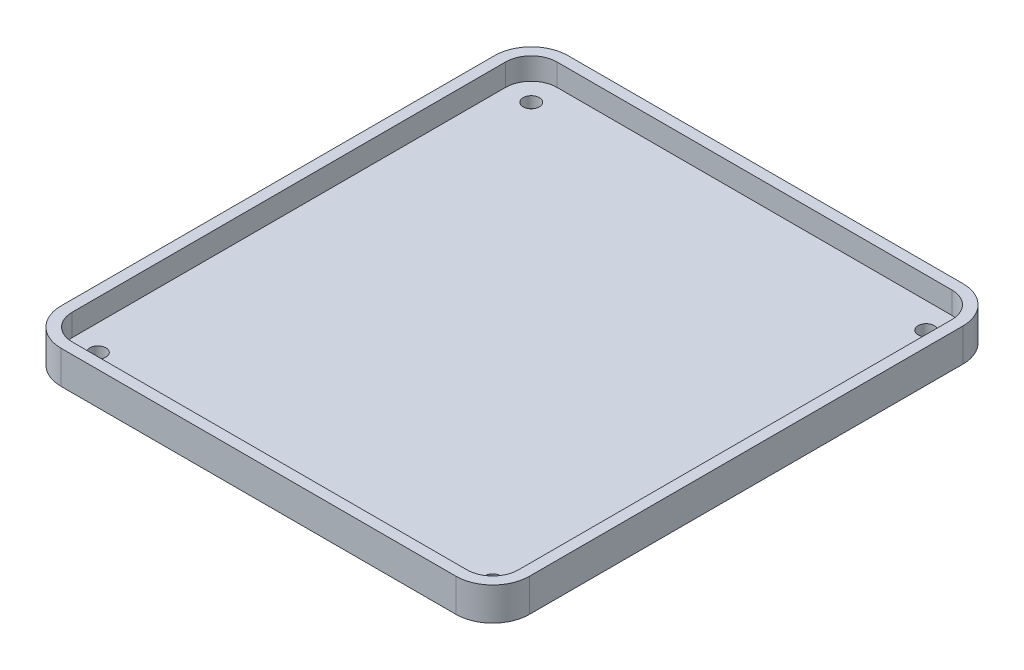
ISO-10303-21;
HEADER;
FILE_DESCRIPTION(('STEP AP214'),'2;1');
FILE_NAME('part.step','',(''),(''),'','','');
FILE_SCHEMA(('AUTOMOTIVE_DESIGN { 1 0 10303 214 1 1 1 1 }'));
ENDSEC;
DATA;
#1=APPLICATION_CONTEXT('core data for automotive mechanical design processes');
#2=APPLICATION_PROTOCOL_DEFINITION('international standard','automotive_design',2000,#1);
#3=PRODUCT_CONTEXT('',#1,'mechanical');
#4=PRODUCT('Part','Part','',(#3));
#5=PRODUCT_RELATED_PRODUCT_CATEGORY('part','',(#4));
#6=PRODUCT_DEFINITION_FORMATION('','',#4);
#7=PRODUCT_DEFINITION_CONTEXT('part definition',#1,'design');
#8=PRODUCT_DEFINITION('design','',#6,#7);
#9=PRODUCT_DEFINITION_SHAPE('','',#8);
#10=(LENGTH_UNIT() NAMED_UNIT(*) SI_UNIT(.MILLI.,.METRE.));
#11=(NAMED_UNIT(*) PLANE_ANGLE_UNIT() SI_UNIT($,.RADIAN.));
#12=(NAMED_UNIT(*) SI_UNIT($,.STERADIAN.) SOLID_ANGLE_UNIT());
#13=UNCERTAINTY_MEASURE_WITH_UNIT(LENGTH_MEASURE(1.E-05),#10,'distance_accuracy_value','');
#14=(GEOMETRIC_REPRESENTATION_CONTEXT(3) GLOBAL_UNCERTAINTY_ASSIGNED_CONTEXT((#13)) GLOBAL_UNIT_ASSIGNED_CONTEXT((#10,
#11,#12)) REPRESENTATION_CONTEXT('',''));
#15=CARTESIAN_POINT('',(0.,0.,0.));
#16=DIRECTION('',(0.,0.,1.));
#17=DIRECTION('',(1.,0.,0.));
#18=AXIS2_PLACEMENT_3D('',#15,#16,#17);
#19=CARTESIAN_POINT('',(10.,3.,-128.));
#20=DIRECTION('',(0.,-1.,0.));
#21=DIRECTION('',(0.,0.,-1.));
#22=AXIS2_PLACEMENT_3D('',#19,#20,#21);
#23=CYLINDRICAL_SURFACE('',#22,10.);
#24=CARTESIAN_POINT('',(10.,0.,-128.));
#25=DIRECTION('',(0.,1.,0.));
#26=DIRECTION('',(0.,0.,1.));
#27=AXIS2_PLACEMENT_3D('',#24,#25,#26);
#28=CIRCLE('',#27,10.);
#29=CARTESIAN_POINT('',(10.0000000000001,0.,-138.));
#30=VERTEX_POINT('',#29);
#31=CARTESIAN_POINT('',(0.,0.,-128.));
#32=VERTEX_POINT('',#31);
#33=EDGE_CURVE('E241',#30,#32,#28,.T.);
#34=ORIENTED_EDGE('',*,*,#33,.T.);
#35=DIRECTION('',(0.,-1.,0.));
#36=VECTOR('',#35,1.);
#37=CARTESIAN_POINT('',(0.,3.,-128.));
#38=LINE('',#37,#36);
#39=CARTESIAN_POINT('',(0.,9.,-128.));
#40=VERTEX_POINT('',#39);
#41=EDGE_CURVE('E11',#40,#32,#38,.T.);
#42=ORIENTED_EDGE('',*,*,#41,.F.);
#43=CARTESIAN_POINT('',(10.,9.,-128.));
#44=DIRECTION('',(0.,1.,0.));
#45=DIRECTION('',(0.,0.,1.));
#46=AXIS2_PLACEMENT_3D('',#43,#44,#45);
#47=CIRCLE('',#46,10.);
#48=CARTESIAN_POINT('',(10.0000000000001,9.,-138.));
#49=VERTEX_POINT('',#48);
#50=EDGE_CURVE('E165',#49,#40,#47,.T.);
#51=ORIENTED_EDGE('',*,*,#50,.F.);
#52=DIRECTION('',(0.,-1.,0.));
#53=VECTOR('',#52,1.);
#54=CARTESIAN_POINT('',(10.0000000000001,3.,-138.));
#55=LINE('',#54,#53);
#56=EDGE_CURVE('E258',#49,#30,#55,.T.);
#57=ORIENTED_EDGE('',*,*,#56,.T.);
#58=EDGE_LOOP('',(#34,#42,#51,#57));
#59=FACE_BOUND('',#58,.T.);
#60=ADVANCED_FACE('F39',(#59),#23,.T.);
#61=CARTESIAN_POINT('',(0.,3.,-10.0000000000001));
#62=DIRECTION('',(1.,0.,0.));
#63=DIRECTION('',(0.,0.,-1.));
#64=AXIS2_PLACEMENT_3D('',#61,#62,#63);
#65=PLANE('',#64);
#66=DIRECTION('',(0.,0.,1.));
#67=VECTOR('',#66,1.);
#68=CARTESIAN_POINT('',(0.,0.,-10.0000000000001));
#69=LINE('',#68,#67);
#70=CARTESIAN_POINT('',(0.,0.,-10.0000000000001));
#71=VERTEX_POINT('',#70);
#72=EDGE_CURVE('E244',#32,#71,#69,.T.);
#73=ORIENTED_EDGE('',*,*,#72,.T.);
#74=DIRECTION('',(0.,-1.,0.));
#75=VECTOR('',#74,1.);
#76=CARTESIAN_POINT('',(0.,3.,-10.0000000000001));
#77=LINE('',#76,#75);
#78=CARTESIAN_POINT('',(0.,9.,-10.0000000000001));
#79=VERTEX_POINT('',#78);
#80=EDGE_CURVE('E46',#79,#71,#77,.T.);
#81=ORIENTED_EDGE('',*,*,#80,.F.);
#82=DIRECTION('',(0.,0.,1.));
#83=VECTOR('',#82,1.);
#84=CARTESIAN_POINT('',(0.,9.,-128.));
#85=LINE('',#84,#83);
#86=EDGE_CURVE('E220',#40,#79,#85,.T.);
#87=ORIENTED_EDGE('',*,*,#86,.F.);
#88=ORIENTED_EDGE('',*,*,#41,.T.);
#89=EDGE_LOOP('',(#73,#81,#87,#88));
#90=FACE_BOUND('',#89,.T.);
#91=ADVANCED_FACE('F308',(#90),#65,.F.);
#92=CARTESIAN_POINT('',(10.,3.,-10.));
#93=DIRECTION('',(0.,-1.,0.));
#94=DIRECTION('',(0.,0.,-1.));
#95=AXIS2_PLACEMENT_3D('',#92,#93,#94);
#96=CYLINDRICAL_SURFACE('',#95,10.);
#97=CARTESIAN_POINT('',(10.,0.,-10.));
#98=DIRECTION('',(0.,1.,0.));
#99=DIRECTION('',(0.,0.,-1.));
#100=AXIS2_PLACEMENT_3D('',#97,#98,#99);
#101=CIRCLE('',#100,10.);
#102=CARTESIAN_POINT('',(10.0000000000001,0.,0.));
#103=VERTEX_POINT('',#102);
#104=EDGE_CURVE('E246',#71,#103,#101,.T.);
#105=ORIENTED_EDGE('',*,*,#104,.T.);
#106=DIRECTION('',(0.,-1.,0.));
#107=VECTOR('',#106,1.);
#108=CARTESIAN_POINT('',(10.0000000000001,3.,0.));
#109=LINE('',#108,#107);
#110=CARTESIAN_POINT('',(10.0000000000001,9.,0.));
#111=VERTEX_POINT('',#110);
#112=EDGE_CURVE('E273',#111,#103,#109,.T.);
#113=ORIENTED_EDGE('',*,*,#112,.F.);
#114=CARTESIAN_POINT('',(10.,9.,-10.));
#115=DIRECTION('',(0.,1.,0.));
#116=DIRECTION('',(0.,0.,1.));
#117=AXIS2_PLACEMENT_3D('',#114,#115,#116);
#118=CIRCLE('',#117,10.);
#119=EDGE_CURVE('E223',#79,#111,#118,.T.);
#120=ORIENTED_EDGE('',*,*,#119,.F.);
#121=ORIENTED_EDGE('',*,*,#80,.T.);
#122=EDGE_LOOP('',(#105,#113,#120,#121));
#123=FACE_BOUND('',#122,.T.);
#124=ADVANCED_FACE('F279',(#123),#96,.T.);
#125=CARTESIAN_POINT('',(10.0000000000001,3.,0.));
#126=DIRECTION('',(0.,0.,-1.));
#127=DIRECTION('',(-1.,0.,0.));
#128=AXIS2_PLACEMENT_3D('',#125,#126,#127);
#129=PLANE('',#128);
#130=DIRECTION('',(1.,0.,0.));
#131=VECTOR('',#130,1.);
#132=CARTESIAN_POINT('',(10.0000000000001,0.,0.));
#133=LINE('',#132,#131);
#134=CARTESIAN_POINT('',(117.5,0.,0.));
#135=VERTEX_POINT('',#134);
#136=EDGE_CURVE('E248',#103,#135,#133,.T.);
#137=ORIENTED_EDGE('',*,*,#136,.T.);
#138=DIRECTION('',(0.,-1.,0.));
#139=VECTOR('',#138,1.);
#140=CARTESIAN_POINT('',(117.5,3.,0.));
#141=LINE('',#140,#139);
#142=CARTESIAN_POINT('',(117.5,9.,0.));
#143=VERTEX_POINT('',#142);
#144=EDGE_CURVE('E270',#143,#135,#141,.T.);
#145=ORIENTED_EDGE('',*,*,#144,.F.);
#146=DIRECTION('',(1.,0.,0.));
#147=VECTOR('',#146,1.);
#148=CARTESIAN_POINT('',(10.0000000000001,9.,0.));
#149=LINE('',#148,#147);
#150=EDGE_CURVE('E226',#111,#143,#149,.T.);
#151=ORIENTED_EDGE('',*,*,#150,.F.);
#152=ORIENTED_EDGE('',*,*,#112,.T.);
#153=EDGE_LOOP('',(#137,#145,#151,#152));
#154=FACE_BOUND('',#153,.T.);
#155=ADVANCED_FACE('F289',(#154),#129,.F.);
#156=CARTESIAN_POINT('',(117.5,3.,-10.));
#157=DIRECTION('',(0.,-1.,0.));
#158=DIRECTION('',(0.,0.,-1.));
#159=AXIS2_PLACEMENT_3D('',#156,#157,#158);
#160=CYLINDRICAL_SURFACE('',#159,10.);
#161=CARTESIAN_POINT('',(117.5,0.,-10.));
#162=DIRECTION('',(0.,1.,0.));
#163=DIRECTION('',(0.,0.,1.));
#164=AXIS2_PLACEMENT_3D('',#161,#162,#163);
#165=CIRCLE('',#164,10.);
#166=CARTESIAN_POINT('',(127.5,0.,-10.0000000000001));
#167=VERTEX_POINT('',#166);
#168=EDGE_CURVE('E250',#135,#167,#165,.T.);
#169=ORIENTED_EDGE('',*,*,#168,.T.);
#170=DIRECTION('',(0.,-1.,0.));
#171=VECTOR('',#170,1.);
#172=CARTESIAN_POINT('',(127.5,3.,-10.0000000000001));
#173=LINE('',#172,#171);
#174=CARTESIAN_POINT('',(127.5,9.,-10.));
#175=VERTEX_POINT('',#174);
#176=EDGE_CURVE('E267',#175,#167,#173,.T.);
#177=ORIENTED_EDGE('',*,*,#176,.F.);
#178=CARTESIAN_POINT('',(117.5,9.,-10.));
#179=DIRECTION('',(0.,1.,0.));
#180=DIRECTION('',(0.,0.,1.));
#181=AXIS2_PLACEMENT_3D('',#178,#179,#180);
#182=CIRCLE('',#181,9.99999999999999);
#183=EDGE_CURVE('E229',#143,#175,#182,.T.);
#184=ORIENTED_EDGE('',*,*,#183,.F.);
#185=ORIENTED_EDGE('',*,*,#144,.T.);
#186=EDGE_LOOP('',(#169,#177,#184,#185));
#187=FACE_BOUND('',#186,.T.);
#188=ADVANCED_FACE('F293',(#187),#160,.T.);
#189=CARTESIAN_POINT('',(127.5,3.,-10.0000000000001));
#190=DIRECTION('',(-1.,0.,0.));
#191=DIRECTION('',(0.,0.,1.));
#192=AXIS2_PLACEMENT_3D('',#189,#190,#191);
#193=PLANE('',#192);
#194=DIRECTION('',(0.,0.,-1.));
#195=VECTOR('',#194,1.);
#196=CARTESIAN_POINT('',(127.5,0.,-10.0000000000001));
#197=LINE('',#196,#195);
#198=CARTESIAN_POINT('',(127.5,0.,-128.));
#199=VERTEX_POINT('',#198);
#200=EDGE_CURVE('E252',#167,#199,#197,.T.);
#201=ORIENTED_EDGE('',*,*,#200,.T.);
#202=DIRECTION('',(0.,-1.,0.));
#203=VECTOR('',#202,1.);
#204=CARTESIAN_POINT('',(127.5,3.,-128.));
#205=LINE('',#204,#203);
#206=CARTESIAN_POINT('',(127.5,9.,-128.));
#207=VERTEX_POINT('',#206);
#208=EDGE_CURVE('E264',#207,#199,#205,.T.);
#209=ORIENTED_EDGE('',*,*,#208,.F.);
#210=DIRECTION('',(0.,0.,-1.));
#211=VECTOR('',#210,1.);
#212=CARTESIAN_POINT('',(127.5,9.,-10.));
#213=LINE('',#212,#211);
#214=EDGE_CURVE('E232',#175,#207,#213,.T.);
#215=ORIENTED_EDGE('',*,*,#214,.F.);
#216=ORIENTED_EDGE('',*,*,#176,.T.);
#217=EDGE_LOOP('',(#201,#209,#215,#216));
#218=FACE_BOUND('',#217,.T.);
#219=ADVANCED_FACE('F298',(#218),#193,.F.);
#220=CARTESIAN_POINT('',(117.5,3.,-128.));
#221=DIRECTION('',(0.,-1.,0.));
#222=DIRECTION('',(0.,0.,-1.));
#223=AXIS2_PLACEMENT_3D('',#220,#221,#222);
#224=CYLINDRICAL_SURFACE('',#223,10.);
#225=CARTESIAN_POINT('',(117.5,0.,-128.));
#226=DIRECTION('',(0.,1.,0.));
#227=DIRECTION('',(0.,0.,1.));
#228=AXIS2_PLACEMENT_3D('',#225,#226,#227);
#229=CIRCLE('',#228,10.);
#230=CARTESIAN_POINT('',(117.5,0.,-138.));
#231=VERTEX_POINT('',#230);
#232=EDGE_CURVE('E254',#199,#231,#229,.T.);
#233=ORIENTED_EDGE('',*,*,#232,.T.);
#234=DIRECTION('',(0.,-1.,0.));
#235=VECTOR('',#234,1.);
#236=CARTESIAN_POINT('',(117.5,3.,-138.));
#237=LINE('',#236,#235);
#238=CARTESIAN_POINT('',(117.5,9.,-138.));
#239=VERTEX_POINT('',#238);
#240=EDGE_CURVE('E261',#239,#231,#237,.T.);
#241=ORIENTED_EDGE('',*,*,#240,.F.);
#242=CARTESIAN_POINT('',(117.5,9.,-128.));
#243=DIRECTION('',(0.,1.,0.));
#244=DIRECTION('',(0.,0.,1.));
#245=AXIS2_PLACEMENT_3D('',#242,#243,#244);
#246=CIRCLE('',#245,10.);
#247=EDGE_CURVE('E235',#207,#239,#246,.T.);
#248=ORIENTED_EDGE('',*,*,#247,.F.);
#249=ORIENTED_EDGE('',*,*,#208,.T.);
#250=EDGE_LOOP('',(#233,#241,#248,#249));
#251=FACE_BOUND('',#250,.T.);
#252=ADVANCED_FACE('F301',(#251),#224,.T.);
#253=CARTESIAN_POINT('',(10.0000000000001,3.,-138.));
#254=DIRECTION('',(0.,0.,1.));
#255=DIRECTION('',(1.,0.,0.));
#256=AXIS2_PLACEMENT_3D('',#253,#254,#255);
#257=PLANE('',#256);
#258=DIRECTION('',(-1.,0.,0.));
#259=VECTOR('',#258,1.);
#260=CARTESIAN_POINT('',(10.0000000000001,0.,-138.));
#261=LINE('',#260,#259);
#262=EDGE_CURVE('E256',#231,#30,#261,.T.);
#263=ORIENTED_EDGE('',*,*,#262,.T.);
#264=ORIENTED_EDGE('',*,*,#56,.F.);
#265=DIRECTION('',(-1.,0.,0.));
#266=VECTOR('',#265,1.);
#267=CARTESIAN_POINT('',(117.5,9.,-138.));
#268=LINE('',#267,#266);
#269=EDGE_CURVE('E238',#239,#49,#268,.T.);
#270=ORIENTED_EDGE('',*,*,#269,.F.);
#271=ORIENTED_EDGE('',*,*,#240,.T.);
#272=EDGE_LOOP('',(#263,#264,#270,#271));
#273=FACE_BOUND('',#272,.T.);
#274=ADVANCED_FACE('F304',(#273),#257,.F.);
#275=CARTESIAN_POINT('',(10.,0.,-128.));
#276=DIRECTION('',(0.,1.,0.));
#277=DIRECTION('',(0.,0.,1.));
#278=AXIS2_PLACEMENT_3D('',#275,#276,#277);
#279=PLANE('',#278);
#280=CARTESIAN_POINT('',(117.5,0.,-128.));
#281=DIRECTION('',(0.,1.,0.));
#282=DIRECTION('',(0.,0.,1.));
#283=AXIS2_PLACEMENT_3D('',#280,#281,#282);
#284=CIRCLE('',#283,2.2);
#285=CARTESIAN_POINT('',(117.5,0.,-125.8));
#286=VERTEX_POINT('',#285);
#287=EDGE_CURVE('E399',#286,#286,#284,.T.);
#288=ORIENTED_EDGE('',*,*,#287,.T.);
#289=EDGE_LOOP('',(#288));
#290=FACE_BOUND('',#289,.T.);
#291=CARTESIAN_POINT('',(10.,0.,-10.));
#292=DIRECTION('',(0.,1.,0.));
#293=DIRECTION('',(0.,0.,1.));
#294=AXIS2_PLACEMENT_3D('',#291,#292,#293);
#295=CIRCLE('',#294,2.2);
#296=CARTESIAN_POINT('',(10.,0.,-7.8));
#297=VERTEX_POINT('',#296);
#298=EDGE_CURVE('E388',#297,#297,#295,.T.);
#299=ORIENTED_EDGE('',*,*,#298,.T.);
#300=EDGE_LOOP('',(#299));
#301=FACE_BOUND('',#300,.T.);
#302=CARTESIAN_POINT('',(117.5,0.,-10.));
#303=DIRECTION('',(0.,1.,0.));
#304=DIRECTION('',(0.,0.,1.));
#305=AXIS2_PLACEMENT_3D('',#302,#303,#304);
#306=CIRCLE('',#305,2.2);
#307=CARTESIAN_POINT('',(117.5,0.,-7.80000000000001));
#308=VERTEX_POINT('',#307);
#309=EDGE_CURVE('E383',#308,#308,#306,.T.);
#310=ORIENTED_EDGE('',*,*,#309,.T.);
#311=EDGE_LOOP('',(#310));
#312=FACE_BOUND('',#311,.T.);
#313=CARTESIAN_POINT('',(9.99999999999999,0.,-128.));
#314=DIRECTION('',(0.,1.,0.));
#315=DIRECTION('',(0.,0.,1.));
#316=AXIS2_PLACEMENT_3D('',#313,#314,#315);
#317=CIRCLE('',#316,2.20000000000001);
#318=CARTESIAN_POINT('',(9.99999999999999,0.,-125.8));
#319=VERTEX_POINT('',#318);
#320=EDGE_CURVE('E188',#319,#319,#317,.T.);
#321=ORIENTED_EDGE('',*,*,#320,.T.);
#322=EDGE_LOOP('',(#321));
#323=FACE_BOUND('',#322,.T.);
#324=ORIENTED_EDGE('',*,*,#33,.F.);
#325=ORIENTED_EDGE('',*,*,#262,.F.);
#326=ORIENTED_EDGE('',*,*,#232,.F.);
#327=ORIENTED_EDGE('',*,*,#200,.F.);
#328=ORIENTED_EDGE('',*,*,#168,.F.);
#329=ORIENTED_EDGE('',*,*,#136,.F.);
#330=ORIENTED_EDGE('',*,*,#104,.F.);
#331=ORIENTED_EDGE('',*,*,#72,.F.);
#332=EDGE_LOOP('',(#324,#325,#326,#327,#328,#329,#330,#331));
#333=FACE_BOUND('',#332,.T.);
#334=ADVANCED_FACE('F285',(#290,#301,#312,#323,#333),#279,.F.);
#335=CARTESIAN_POINT('',(10.,9.,-128.));
#336=DIRECTION('',(0.,1.,0.));
#337=DIRECTION('',(0.,0.,1.));
#338=AXIS2_PLACEMENT_3D('',#335,#336,#337);
#339=PLANE('',#338);
#340=ORIENTED_EDGE('',*,*,#50,.T.);
#341=ORIENTED_EDGE('',*,*,#86,.T.);
#342=ORIENTED_EDGE('',*,*,#119,.T.);
#343=ORIENTED_EDGE('',*,*,#150,.T.);
#344=ORIENTED_EDGE('',*,*,#183,.T.);
#345=ORIENTED_EDGE('',*,*,#214,.T.);
#346=ORIENTED_EDGE('',*,*,#247,.T.);
#347=ORIENTED_EDGE('',*,*,#269,.T.);
#348=EDGE_LOOP('',(#340,#341,#342,#343,#344,#345,#346,#347));
#349=FACE_BOUND('',#348,.T.);
#350=DIRECTION('',(-1.,0.,0.));
#351=VECTOR('',#350,1.);
#352=CARTESIAN_POINT('',(117.5,9.,-135.));
#353=LINE('',#352,#351);
#354=CARTESIAN_POINT('',(117.5,9.,-135.));
#355=VERTEX_POINT('',#354);
#356=CARTESIAN_POINT('',(10.0000000000001,9.,-135.));
#357=VERTEX_POINT('',#356);
#358=EDGE_CURVE('E159',#355,#357,#353,.T.);
#359=ORIENTED_EDGE('',*,*,#358,.F.);
#360=CARTESIAN_POINT('',(117.5,9.,-128.));
#361=DIRECTION('',(0.,1.,0.));
#362=DIRECTION('',(0.,0.,1.));
#363=AXIS2_PLACEMENT_3D('',#360,#361,#362);
#364=CIRCLE('',#363,7.);
#365=CARTESIAN_POINT('',(124.5,9.,-128.));
#366=VERTEX_POINT('',#365);
#367=EDGE_CURVE('E150',#366,#355,#364,.T.);
#368=ORIENTED_EDGE('',*,*,#367,.F.);
#369=DIRECTION('',(0.,0.,-1.));
#370=VECTOR('',#369,1.);
#371=CARTESIAN_POINT('',(124.5,9.,-10.));
#372=LINE('',#371,#370);
#373=CARTESIAN_POINT('',(124.5,9.,-10.));
#374=VERTEX_POINT('',#373);
#375=EDGE_CURVE('E185',#374,#366,#372,.T.);
#376=ORIENTED_EDGE('',*,*,#375,.F.);
#377=CARTESIAN_POINT('',(117.5,9.,-10.));
#378=DIRECTION('',(0.,1.,0.));
#379=DIRECTION('',(0.,0.,1.));
#380=AXIS2_PLACEMENT_3D('',#377,#378,#379);
#381=CIRCLE('',#380,7.);
#382=CARTESIAN_POINT('',(117.5,9.,-3.));
#383=VERTEX_POINT('',#382);
#384=EDGE_CURVE('E182',#383,#374,#381,.T.);
#385=ORIENTED_EDGE('',*,*,#384,.F.);
#386=DIRECTION('',(1.,0.,0.));
#387=VECTOR('',#386,1.);
#388=CARTESIAN_POINT('',(10.,9.,-3.));
#389=LINE('',#388,#387);
#390=CARTESIAN_POINT('',(10.,9.,-3.));
#391=VERTEX_POINT('',#390);
#392=EDGE_CURVE('E180',#391,#383,#389,.T.);
#393=ORIENTED_EDGE('',*,*,#392,.F.);
#394=CARTESIAN_POINT('',(10.,9.,-10.));
#395=DIRECTION('',(0.,1.,0.));
#396=DIRECTION('',(0.,0.,1.));
#397=AXIS2_PLACEMENT_3D('',#394,#395,#396);
#398=CIRCLE('',#397,7.);
#399=CARTESIAN_POINT('',(3.,9.,-10.0000000000001));
#400=VERTEX_POINT('',#399);
#401=EDGE_CURVE('E178',#400,#391,#398,.T.);
#402=ORIENTED_EDGE('',*,*,#401,.F.);
#403=DIRECTION('',(0.,0.,1.));
#404=VECTOR('',#403,1.);
#405=CARTESIAN_POINT('',(2.99999999999999,9.,-128.));
#406=LINE('',#405,#404);
#407=CARTESIAN_POINT('',(2.99999999999999,9.,-128.));
#408=VERTEX_POINT('',#407);
#409=EDGE_CURVE('E173',#408,#400,#406,.T.);
#410=ORIENTED_EDGE('',*,*,#409,.F.);
#411=CARTESIAN_POINT('',(10.,9.,-128.));
#412=DIRECTION('',(0.,1.,0.));
#413=DIRECTION('',(0.,0.,1.));
#414=AXIS2_PLACEMENT_3D('',#411,#412,#413);
#415=CIRCLE('',#414,7.);
#416=EDGE_CURVE('E171',#357,#408,#415,.T.);
#417=ORIENTED_EDGE('',*,*,#416,.F.);
#418=EDGE_LOOP('',(#359,#368,#376,#385,#393,#402,#410,#417));
#419=FACE_BOUND('',#418,.T.);
#420=ADVANCED_FACE('F169',(#349,#419),#339,.T.);
#421=CARTESIAN_POINT('',(117.5,9.,-128.));
#422=DIRECTION('',(0.,-1.,0.));
#423=DIRECTION('',(0.,0.,-1.));
#424=AXIS2_PLACEMENT_3D('',#421,#422,#423);
#425=CYLINDRICAL_SURFACE('',#424,7.);
#426=CARTESIAN_POINT('',(117.5,3.,-128.));
#427=DIRECTION('',(0.,1.,0.));
#428=DIRECTION('',(0.,0.,1.));
#429=AXIS2_PLACEMENT_3D('',#426,#427,#428);
#430=CIRCLE('',#429,7.);
#431=CARTESIAN_POINT('',(124.5,3.,-128.));
#432=VERTEX_POINT('',#431);
#433=CARTESIAN_POINT('',(117.5,3.,-135.));
#434=VERTEX_POINT('',#433);
#435=EDGE_CURVE('E53',#432,#434,#430,.T.);
#436=ORIENTED_EDGE('',*,*,#435,.F.);
#437=DIRECTION('',(0.,-1.,0.));
#438=VECTOR('',#437,1.);
#439=CARTESIAN_POINT('',(124.5,9.,-128.));
#440=LINE('',#439,#438);
#441=EDGE_CURVE('E155',#366,#432,#440,.T.);
#442=ORIENTED_EDGE('',*,*,#441,.F.);
#443=ORIENTED_EDGE('',*,*,#367,.T.);
#444=DIRECTION('',(0.,-1.,0.));
#445=VECTOR('',#444,1.);
#446=CARTESIAN_POINT('',(117.5,9.,-135.));
#447=LINE('',#446,#445);
#448=EDGE_CURVE('E153',#355,#434,#447,.T.);
#449=ORIENTED_EDGE('',*,*,#448,.T.);
#450=EDGE_LOOP('',(#436,#442,#443,#449));
#451=FACE_BOUND('',#450,.T.);
#452=ADVANCED_FACE('F152',(#451),#425,.F.);
#453=CARTESIAN_POINT('',(117.5,9.,-135.));
#454=DIRECTION('',(0.,0.,1.));
#455=DIRECTION('',(1.,0.,0.));
#456=AXIS2_PLACEMENT_3D('',#453,#454,#455);
#457=PLANE('',#456);
#458=DIRECTION('',(-1.,0.,0.));
#459=VECTOR('',#458,1.);
#460=CARTESIAN_POINT('',(117.5,3.,-135.));
#461=LINE('',#460,#459);
#462=CARTESIAN_POINT('',(10.0000000000001,3.,-135.));
#463=VERTEX_POINT('',#462);
#464=EDGE_CURVE('E57',#434,#463,#461,.T.);
#465=ORIENTED_EDGE('',*,*,#464,.F.);
#466=ORIENTED_EDGE('',*,*,#448,.F.);
#467=ORIENTED_EDGE('',*,*,#358,.T.);
#468=DIRECTION('',(0.,-1.,0.));
#469=VECTOR('',#468,1.);
#470=CARTESIAN_POINT('',(10.0000000000001,9.,-135.));
#471=LINE('',#470,#469);
#472=EDGE_CURVE('E166',#357,#463,#471,.T.);
#473=ORIENTED_EDGE('',*,*,#472,.T.);
#474=EDGE_LOOP('',(#465,#466,#467,#473));
#475=FACE_BOUND('',#474,.T.);
#476=ADVANCED_FACE('F163',(#475),#457,.T.);
#477=CARTESIAN_POINT('',(10.,9.,-128.));
#478=DIRECTION('',(0.,-1.,0.));
#479=DIRECTION('',(0.,0.,-1.));
#480=AXIS2_PLACEMENT_3D('',#477,#478,#479);
#481=CYLINDRICAL_SURFACE('',#480,7.);
#482=CARTESIAN_POINT('',(10.,3.,-128.));
#483=DIRECTION('',(0.,1.,0.));
#484=DIRECTION('',(0.,0.,1.));
#485=AXIS2_PLACEMENT_3D('',#482,#483,#484);
#486=CIRCLE('',#485,7.);
#487=CARTESIAN_POINT('',(2.99999999999999,3.,-128.));
#488=VERTEX_POINT('',#487);
#489=EDGE_CURVE('E190',#463,#488,#486,.T.);
#490=ORIENTED_EDGE('',*,*,#489,.F.);
#491=ORIENTED_EDGE('',*,*,#472,.F.);
#492=ORIENTED_EDGE('',*,*,#416,.T.);
#493=DIRECTION('',(0.,-1.,0.));
#494=VECTOR('',#493,1.);
#495=CARTESIAN_POINT('',(2.99999999999999,9.,-128.));
#496=LINE('',#495,#494);
#497=EDGE_CURVE('E214',#408,#488,#496,.T.);
#498=ORIENTED_EDGE('',*,*,#497,.T.);
#499=EDGE_LOOP('',(#490,#491,#492,#498));
#500=FACE_BOUND('',#499,.T.);
#501=ADVANCED_FACE('F341',(#500),#481,.F.);
#502=CARTESIAN_POINT('',(2.99999999999999,9.,-128.));
#503=DIRECTION('',(1.,0.,0.));
#504=DIRECTION('',(0.,0.,-1.));
#505=AXIS2_PLACEMENT_3D('',#502,#503,#504);
#506=PLANE('',#505);
#507=DIRECTION('',(0.,0.,1.));
#508=VECTOR('',#507,1.);
#509=CARTESIAN_POINT('',(2.99999999999999,3.,-128.));
#510=LINE('',#509,#508);
#511=CARTESIAN_POINT('',(3.,3.,-10.0000000000001));
#512=VERTEX_POINT('',#511);
#513=EDGE_CURVE('E192',#488,#512,#510,.T.);
#514=ORIENTED_EDGE('',*,*,#513,.F.);
#515=ORIENTED_EDGE('',*,*,#497,.F.);
#516=ORIENTED_EDGE('',*,*,#409,.T.);
#517=DIRECTION('',(0.,-1.,0.));
#518=VECTOR('',#517,1.);
#519=CARTESIAN_POINT('',(3.,9.,-10.0000000000001));
#520=LINE('',#519,#518);
#521=EDGE_CURVE('E211',#400,#512,#520,.T.);
#522=ORIENTED_EDGE('',*,*,#521,.T.);
#523=EDGE_LOOP('',(#514,#515,#516,#522));
#524=FACE_BOUND('',#523,.T.);
#525=ADVANCED_FACE('F344',(#524),#506,.T.);
#526=CARTESIAN_POINT('',(10.,9.,-10.));
#527=DIRECTION('',(0.,-1.,0.));
#528=DIRECTION('',(0.,0.,-1.));
#529=AXIS2_PLACEMENT_3D('',#526,#527,#528);
#530=CYLINDRICAL_SURFACE('',#529,7.);
#531=CARTESIAN_POINT('',(10.,3.,-10.));
#532=DIRECTION('',(0.,1.,0.));
#533=DIRECTION('',(0.,0.,1.));
#534=AXIS2_PLACEMENT_3D('',#531,#532,#533);
#535=CIRCLE('',#534,7.);
#536=CARTESIAN_POINT('',(10.,3.,-3.));
#537=VERTEX_POINT('',#536);
#538=EDGE_CURVE('E194',#512,#537,#535,.T.);
#539=ORIENTED_EDGE('',*,*,#538,.F.);
#540=ORIENTED_EDGE('',*,*,#521,.F.);
#541=ORIENTED_EDGE('',*,*,#401,.T.);
#542=DIRECTION('',(0.,-1.,0.));
#543=VECTOR('',#542,1.);
#544=CARTESIAN_POINT('',(10.,9.,-3.));
#545=LINE('',#544,#543);
#546=EDGE_CURVE('E208',#391,#537,#545,.T.);
#547=ORIENTED_EDGE('',*,*,#546,.T.);
#548=EDGE_LOOP('',(#539,#540,#541,#547));
#549=FACE_BOUND('',#548,.T.);
#550=ADVANCED_FACE('F348',(#549),#530,.F.);
#551=CARTESIAN_POINT('',(10.,9.,-3.));
#552=DIRECTION('',(0.,0.,-1.));
#553=DIRECTION('',(-1.,0.,0.));
#554=AXIS2_PLACEMENT_3D('',#551,#552,#553);
#555=PLANE('',#554);
#556=DIRECTION('',(1.,0.,0.));
#557=VECTOR('',#556,1.);
#558=CARTESIAN_POINT('',(10.,3.,-3.));
#559=LINE('',#558,#557);
#560=CARTESIAN_POINT('',(117.5,3.,-3.));
#561=VERTEX_POINT('',#560);
#562=EDGE_CURVE('E196',#537,#561,#559,.T.);
#563=ORIENTED_EDGE('',*,*,#562,.F.);
#564=ORIENTED_EDGE('',*,*,#546,.F.);
#565=ORIENTED_EDGE('',*,*,#392,.T.);
#566=DIRECTION('',(0.,-1.,0.));
#567=VECTOR('',#566,1.);
#568=CARTESIAN_POINT('',(117.5,9.,-3.));
#569=LINE('',#568,#567);
#570=EDGE_CURVE('E205',#383,#561,#569,.T.);
#571=ORIENTED_EDGE('',*,*,#570,.T.);
#572=EDGE_LOOP('',(#563,#564,#565,#571));
#573=FACE_BOUND('',#572,.T.);
#574=ADVANCED_FACE('F352',(#573),#555,.T.);
#575=CARTESIAN_POINT('',(117.5,9.,-10.));
#576=DIRECTION('',(0.,-1.,0.));
#577=DIRECTION('',(0.,0.,-1.));
#578=AXIS2_PLACEMENT_3D('',#575,#576,#577);
#579=CYLINDRICAL_SURFACE('',#578,7.);
#580=CARTESIAN_POINT('',(117.5,3.,-10.));
#581=DIRECTION('',(0.,1.,0.));
#582=DIRECTION('',(0.,0.,1.));
#583=AXIS2_PLACEMENT_3D('',#580,#581,#582);
#584=CIRCLE('',#583,7.);
#585=CARTESIAN_POINT('',(124.5,3.,-10.));
#586=VERTEX_POINT('',#585);
#587=EDGE_CURVE('E198',#561,#586,#584,.T.);
#588=ORIENTED_EDGE('',*,*,#587,.F.);
#589=ORIENTED_EDGE('',*,*,#570,.F.);
#590=ORIENTED_EDGE('',*,*,#384,.T.);
#591=DIRECTION('',(0.,-1.,0.));
#592=VECTOR('',#591,1.);
#593=CARTESIAN_POINT('',(124.5,9.,-10.));
#594=LINE('',#593,#592);
#595=EDGE_CURVE('E202',#374,#586,#594,.T.);
#596=ORIENTED_EDGE('',*,*,#595,.T.);
#597=EDGE_LOOP('',(#588,#589,#590,#596));
#598=FACE_BOUND('',#597,.T.);
#599=ADVANCED_FACE('F356',(#598),#579,.F.);
#600=CARTESIAN_POINT('',(124.5,9.,-10.));
#601=DIRECTION('',(-1.,0.,0.));
#602=DIRECTION('',(0.,0.,1.));
#603=AXIS2_PLACEMENT_3D('',#600,#601,#602);
#604=PLANE('',#603);
#605=DIRECTION('',(0.,0.,-1.));
#606=VECTOR('',#605,1.);
#607=CARTESIAN_POINT('',(124.5,3.,-10.));
#608=LINE('',#607,#606);
#609=EDGE_CURVE('E160',#586,#432,#608,.T.);
#610=ORIENTED_EDGE('',*,*,#609,.F.);
#611=ORIENTED_EDGE('',*,*,#595,.F.);
#612=ORIENTED_EDGE('',*,*,#375,.T.);
#613=ORIENTED_EDGE('',*,*,#441,.T.);
#614=EDGE_LOOP('',(#610,#611,#612,#613));
#615=FACE_BOUND('',#614,.T.);
#616=ADVANCED_FACE('F333',(#615),#604,.T.);
#617=CARTESIAN_POINT('',(10.,3.,-128.));
#618=DIRECTION('',(0.,1.,0.));
#619=DIRECTION('',(0.,0.,1.));
#620=AXIS2_PLACEMENT_3D('',#617,#618,#619);
#621=PLANE('',#620);
#622=CARTESIAN_POINT('',(117.5,3.,-128.));
#623=DIRECTION('',(0.,1.,0.));
#624=DIRECTION('',(0.,0.,1.));
#625=AXIS2_PLACEMENT_3D('',#622,#623,#624);
#626=CIRCLE('',#625,2.2);
#627=CARTESIAN_POINT('',(117.5,3.,-125.8));
#628=VERTEX_POINT('',#627);
#629=EDGE_CURVE('E395',#628,#628,#626,.T.);
#630=ORIENTED_EDGE('',*,*,#629,.F.);
#631=EDGE_LOOP('',(#630));
#632=FACE_BOUND('',#631,.T.);
#633=CARTESIAN_POINT('',(10.,3.,-10.));
#634=DIRECTION('',(0.,1.,0.));
#635=DIRECTION('',(0.,0.,1.));
#636=AXIS2_PLACEMENT_3D('',#633,#634,#635);
#637=CIRCLE('',#636,2.2);
#638=CARTESIAN_POINT('',(10.,3.,-7.8));
#639=VERTEX_POINT('',#638);
#640=EDGE_CURVE('E391',#639,#639,#637,.T.);
#641=ORIENTED_EDGE('',*,*,#640,.F.);
#642=EDGE_LOOP('',(#641));
#643=FACE_BOUND('',#642,.T.);
#644=CARTESIAN_POINT('',(117.5,3.,-10.));
#645=DIRECTION('',(0.,1.,0.));
#646=DIRECTION('',(0.,0.,1.));
#647=AXIS2_PLACEMENT_3D('',#644,#645,#646);
#648=CIRCLE('',#647,2.2);
#649=CARTESIAN_POINT('',(117.5,3.,-7.80000000000001));
#650=VERTEX_POINT('',#649);
#651=EDGE_CURVE('E386',#650,#650,#648,.T.);
#652=ORIENTED_EDGE('',*,*,#651,.F.);
#653=EDGE_LOOP('',(#652));
#654=FACE_BOUND('',#653,.T.);
#655=CARTESIAN_POINT('',(9.99999999999999,3.,-128.));
#656=DIRECTION('',(0.,1.,0.));
#657=DIRECTION('',(0.,0.,1.));
#658=AXIS2_PLACEMENT_3D('',#655,#656,#657);
#659=CIRCLE('',#658,2.20000000000001);
#660=CARTESIAN_POINT('',(9.99999999999999,3.,-125.8));
#661=VERTEX_POINT('',#660);
#662=EDGE_CURVE('E398',#661,#661,#659,.T.);
#663=ORIENTED_EDGE('',*,*,#662,.F.);
#664=EDGE_LOOP('',(#663));
#665=FACE_BOUND('',#664,.T.);
#666=ORIENTED_EDGE('',*,*,#435,.T.);
#667=ORIENTED_EDGE('',*,*,#464,.T.);
#668=ORIENTED_EDGE('',*,*,#489,.T.);
#669=ORIENTED_EDGE('',*,*,#513,.T.);
#670=ORIENTED_EDGE('',*,*,#538,.T.);
#671=ORIENTED_EDGE('',*,*,#562,.T.);
#672=ORIENTED_EDGE('',*,*,#587,.T.);
#673=ORIENTED_EDGE('',*,*,#609,.T.);
#674=EDGE_LOOP('',(#666,#667,#668,#669,#670,#671,#672,#673));
#675=FACE_BOUND('',#674,.T.);
#676=ADVANCED_FACE('F329',(#632,#643,#654,#665,#675),#621,.T.);
#677=CARTESIAN_POINT('',(9.99999999999999,0.,-128.));
#678=DIRECTION('',(0.,1.,0.));
#679=DIRECTION('',(0.,0.,1.));
#680=AXIS2_PLACEMENT_3D('',#677,#678,#679);
#681=CYLINDRICAL_SURFACE('',#680,2.20000000000001);
#682=ORIENTED_EDGE('',*,*,#320,.F.);
#683=EDGE_LOOP('',(#682));
#684=FACE_BOUND('',#683,.T.);
#685=ORIENTED_EDGE('',*,*,#662,.T.);
#686=EDGE_LOOP('',(#685));
#687=FACE_BOUND('',#686,.T.);
#688=ADVANCED_FACE('F332',(#684,#687),#681,.F.);
#689=CARTESIAN_POINT('',(117.5,0.,-10.));
#690=DIRECTION('',(0.,1.,0.));
#691=DIRECTION('',(0.,0.,1.));
#692=AXIS2_PLACEMENT_3D('',#689,#690,#691);
#693=CYLINDRICAL_SURFACE('',#692,2.2);
#694=ORIENTED_EDGE('',*,*,#309,.F.);
#695=EDGE_LOOP('',(#694));
#696=FACE_BOUND('',#695,.T.);
#697=ORIENTED_EDGE('',*,*,#651,.T.);
#698=EDGE_LOOP('',(#697));
#699=FACE_BOUND('',#698,.T.);
#700=ADVANCED_FACE('F366',(#696,#699),#693,.F.);
#701=CARTESIAN_POINT('',(10.,0.,-10.));
#702=DIRECTION('',(0.,1.,0.));
#703=DIRECTION('',(0.,0.,1.));
#704=AXIS2_PLACEMENT_3D('',#701,#702,#703);
#705=CYLINDRICAL_SURFACE('',#704,2.2);
#706=ORIENTED_EDGE('',*,*,#298,.F.);
#707=EDGE_LOOP('',(#706));
#708=FACE_BOUND('',#707,.T.);
#709=ORIENTED_EDGE('',*,*,#640,.T.);
#710=EDGE_LOOP('',(#709));
#711=FACE_BOUND('',#710,.T.);
#712=ADVANCED_FACE('F368',(#708,#711),#705,.F.);
#713=CARTESIAN_POINT('',(117.5,0.,-128.));
#714=DIRECTION('',(0.,1.,0.));
#715=DIRECTION('',(0.,0.,1.));
#716=AXIS2_PLACEMENT_3D('',#713,#714,#715);
#717=CYLINDRICAL_SURFACE('',#716,2.2);
#718=ORIENTED_EDGE('',*,*,#287,.F.);
#719=EDGE_LOOP('',(#718));
#720=FACE_BOUND('',#719,.T.);
#721=ORIENTED_EDGE('',*,*,#629,.T.);
#722=EDGE_LOOP('',(#721));
#723=FACE_BOUND('',#722,.T.);
#724=ADVANCED_FACE('F371',(#720,#723),#717,.F.);
#725=CLOSED_SHELL('',(#60,#91,#124,#155,#188,#219,#252,#274,#334,#420,#452,#476,#501,#525,#550,
#574,#599,#616,#676,#688,#700,#712,#724));
#726=MANIFOLD_SOLID_BREP('B2',#725);
#727=ADVANCED_BREP_SHAPE_REPRESENTATION('',(#18,#726),#14);
#728=SHAPE_DEFINITION_REPRESENTATION(#9,#727);
ENDSEC;
END-ISO-10303-21;
